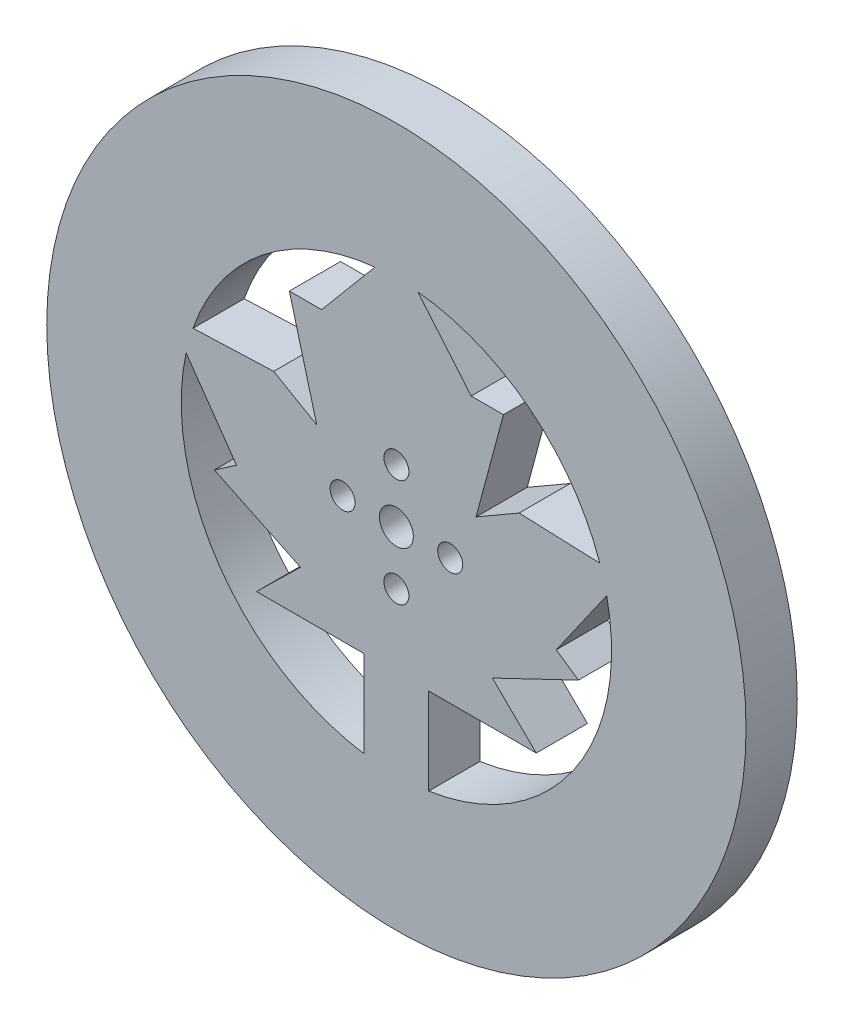
ISO-10303-21;
HEADER;
FILE_DESCRIPTION(('STEP AP214'),'2;1');
FILE_NAME('part.step','',(''),(''),'','','');
FILE_SCHEMA(('AUTOMOTIVE_DESIGN { 1 0 10303 214 1 1 1 1 }'));
ENDSEC;
DATA;
#1=APPLICATION_CONTEXT('core data for automotive mechanical design processes');
#2=APPLICATION_PROTOCOL_DEFINITION('international standard','automotive_design',2000,#1);
#3=PRODUCT_CONTEXT('',#1,'mechanical');
#4=PRODUCT('Part','Part','',(#3));
#5=PRODUCT_RELATED_PRODUCT_CATEGORY('part','',(#4));
#6=PRODUCT_DEFINITION_FORMATION('','',#4);
#7=PRODUCT_DEFINITION_CONTEXT('part definition',#1,'design');
#8=PRODUCT_DEFINITION('design','',#6,#7);
#9=PRODUCT_DEFINITION_SHAPE('','',#8);
#10=(LENGTH_UNIT() NAMED_UNIT(*) SI_UNIT(.MILLI.,.METRE.));
#11=(NAMED_UNIT(*) PLANE_ANGLE_UNIT() SI_UNIT($,.RADIAN.));
#12=(NAMED_UNIT(*) SI_UNIT($,.STERADIAN.) SOLID_ANGLE_UNIT());
#13=UNCERTAINTY_MEASURE_WITH_UNIT(LENGTH_MEASURE(1.E-05),#10,'distance_accuracy_value','');
#14=(GEOMETRIC_REPRESENTATION_CONTEXT(3) GLOBAL_UNCERTAINTY_ASSIGNED_CONTEXT((#13)) GLOBAL_UNIT_ASSIGNED_CONTEXT((#10,
#11,#12)) REPRESENTATION_CONTEXT('',''));
#15=CARTESIAN_POINT('',(0.,0.,0.));
#16=DIRECTION('',(0.,0.,1.));
#17=DIRECTION('',(1.,0.,0.));
#18=AXIS2_PLACEMENT_3D('',#15,#16,#17);
#19=CARTESIAN_POINT('',(0.,0.,6.0452));
#20=DIRECTION('',(0.,0.,1.));
#21=DIRECTION('',(1.,0.,0.));
#22=AXIS2_PLACEMENT_3D('',#19,#20,#21);
#23=PLANE('',#22);
#24=DIRECTION('',(0.866025403784438,-0.500000000000001,0.));
#25=VECTOR('',#24,1.);
#26=CARTESIAN_POINT('',(-9.40429877514202,5.715,6.0452));
#27=LINE('',#26,#25);
#28=CARTESIAN_POINT('',(-14.484298775142,8.64793936748331,6.0452));
#29=VERTEX_POINT('',#28);
#30=CARTESIAN_POINT('',(-9.40429877514202,5.715,6.0452));
#31=VERTEX_POINT('',#30);
#32=EDGE_CURVE('E57',#29,#31,#27,.T.);
#33=ORIENTED_EDGE('',*,*,#32,.F.);
#34=DIRECTION('',(0.999292156618125,0.0376189542850038,0.));
#35=VECTOR('',#34,1.);
#36=CARTESIAN_POINT('',(-14.484298775142,8.64793936748331,6.0452));
#37=LINE('',#36,#35);
#38=CARTESIAN_POINT('',(-24.009298775142,8.28936501343522,6.0452));
#39=VERTEX_POINT('',#38);
#40=EDGE_CURVE('E286',#39,#29,#37,.T.);
#41=ORIENTED_EDGE('',*,*,#40,.F.);
#42=CARTESIAN_POINT('',(0.,0.,6.0452));
#43=DIRECTION('',(0.,0.,1.));
#44=DIRECTION('',(1.,0.,0.));
#45=AXIS2_PLACEMENT_3D('',#42,#43,#44);
#46=CIRCLE('',#45,25.4);
#47=CARTESIAN_POINT('',(-2.54,25.2726809025081,6.0452));
#48=VERTEX_POINT('',#47);
#49=EDGE_CURVE('E292',#48,#39,#46,.T.);
#50=ORIENTED_EDGE('',*,*,#49,.F.);
#51=DIRECTION('',(0.642787609686535,0.766044443118981,0.));
#52=VECTOR('',#51,1.);
#53=CARTESIAN_POINT('',(-8.82710578182357,17.78,6.0452));
#54=LINE('',#53,#52);
#55=CARTESIAN_POINT('',(-8.82710578182357,17.78,6.0452));
#56=VERTEX_POINT('',#55);
#57=EDGE_CURVE('E314',#56,#48,#54,.T.);
#58=ORIENTED_EDGE('',*,*,#57,.F.);
#59=DIRECTION('',(1.,0.,0.));
#60=VECTOR('',#59,1.);
#61=CARTESIAN_POINT('',(-8.82710578182357,17.78,6.0452));
#62=LINE('',#61,#60);
#63=CARTESIAN_POINT('',(-12.6371057818236,17.78,6.0452));
#64=VERTEX_POINT('',#63);
#65=EDGE_CURVE('E310',#64,#56,#62,.T.);
#66=ORIENTED_EDGE('',*,*,#65,.F.);
#67=DIRECTION('',(-0.258819045102525,0.965925826289067,0.));
#68=VECTOR('',#67,1.);
#69=CARTESIAN_POINT('',(-12.6371057818236,17.78,6.0452));
#70=LINE('',#69,#68);
#71=EDGE_CURVE('E307',#31,#64,#70,.T.);
#72=ORIENTED_EDGE('',*,*,#71,.F.);
#73=EDGE_LOOP('',(#33,#41,#50,#58,#66,#72));
#74=FACE_BOUND('',#73,.T.);
#75=DIRECTION('',(0.824862499279753,-0.565333403649527,0.));
#76=VECTOR('',#75,1.);
#77=CARTESIAN_POINT('',(18.8681431333184,-3.1406349865648,6.0452));
#78=LINE('',#77,#76);
#79=CARTESIAN_POINT('',(18.8681431333184,-3.1406349865648,6.0452));
#80=VERTEX_POINT('',#79);
#81=CARTESIAN_POINT('',(21.4870815685317,-4.93556854315204,6.0452));
#82=VERTEX_POINT('',#81);
#83=EDGE_CURVE('E323',#80,#82,#78,.T.);
#84=ORIENTED_EDGE('',*,*,#83,.F.);
#85=DIRECTION('',(-0.573576436351042,-0.819152044288995,0.));
#86=VECTOR('',#85,1.);
#87=CARTESIAN_POINT('',(18.8681431333184,-3.1406349865648,6.0452));
#88=LINE('',#87,#86);
#89=CARTESIAN_POINT('',(24.8262090759448,5.36836501343522,6.0452));
#90=VERTEX_POINT('',#89);
#91=EDGE_CURVE('E340',#90,#80,#88,.T.);
#92=ORIENTED_EDGE('',*,*,#91,.F.);
#93=CARTESIAN_POINT('',(0.,0.,6.0452));
#94=DIRECTION('',(0.,0.,1.));
#95=DIRECTION('',(1.,0.,0.));
#96=AXIS2_PLACEMENT_3D('',#93,#94,#95);
#97=CIRCLE('',#96,25.4);
#98=CARTESIAN_POINT('',(3.81,-25.1126243152722,6.0452));
#99=VERTEX_POINT('',#98);
#100=EDGE_CURVE('E383',#99,#90,#97,.T.);
#101=ORIENTED_EDGE('',*,*,#100,.F.);
#102=DIRECTION('',(0.,-1.,0.));
#103=VECTOR('',#102,1.);
#104=CARTESIAN_POINT('',(3.81,-14.8778779193598,6.0452));
#105=LINE('',#104,#103);
#106=CARTESIAN_POINT('',(3.81,-14.8778779193598,6.0452));
#107=VERTEX_POINT('',#106);
#108=EDGE_CURVE('E379',#107,#99,#105,.T.);
#109=ORIENTED_EDGE('',*,*,#108,.F.);
#110=DIRECTION('',(-1.,0.,0.));
#111=VECTOR('',#110,1.);
#112=CARTESIAN_POINT('',(16.51,-14.8778779193598,6.0452));
#113=LINE('',#112,#111);
#114=CARTESIAN_POINT('',(16.51,-14.8778779193598,6.0452));
#115=VERTEX_POINT('',#114);
#116=EDGE_CURVE('E375',#115,#107,#113,.T.);
#117=ORIENTED_EDGE('',*,*,#116,.F.);
#118=DIRECTION('',(0.714161869141744,-0.699980588776554,0.));
#119=VECTOR('',#118,1.);
#120=CARTESIAN_POINT('',(11.3270815685317,-9.79787791935976,6.0452));
#121=LINE('',#120,#119);
#122=CARTESIAN_POINT('',(11.3270815685317,-9.79787791935976,6.0452));
#123=VERTEX_POINT('',#122);
#124=EDGE_CURVE('E371',#123,#115,#121,.T.);
#125=ORIENTED_EDGE('',*,*,#124,.F.);
#126=DIRECTION('',(-0.902024338808291,-0.431685177180622,0.));
#127=VECTOR('',#126,1.);
#128=CARTESIAN_POINT('',(21.4870815685317,-4.93556854315205,6.0452));
#129=LINE('',#128,#127);
#130=EDGE_CURVE('E367',#82,#123,#129,.T.);
#131=ORIENTED_EDGE('',*,*,#130,.F.);
#132=EDGE_LOOP('',(#84,#92,#101,#109,#117,#125,#131));
#133=FACE_BOUND('',#132,.T.);
#134=DIRECTION('',(0.866025403784438,0.500000000000001,0.));
#135=VECTOR('',#134,1.);
#136=CARTESIAN_POINT('',(9.40429877514202,5.715,6.0452));
#137=LINE('',#136,#135);
#138=CARTESIAN_POINT('',(9.40429877514202,5.715,6.0452));
#139=VERTEX_POINT('',#138);
#140=CARTESIAN_POINT('',(14.484298775142,8.64793936748331,6.0452));
#141=VERTEX_POINT('',#140);
#142=EDGE_CURVE('E393',#139,#141,#137,.T.);
#143=ORIENTED_EDGE('',*,*,#142,.F.);
#144=DIRECTION('',(-0.258819045102525,-0.965925826289067,0.));
#145=VECTOR('',#144,1.);
#146=CARTESIAN_POINT('',(12.6371057818236,17.78,6.0452));
#147=LINE('',#146,#145);
#148=CARTESIAN_POINT('',(12.6371057818236,17.78,6.0452));
#149=VERTEX_POINT('',#148);
#150=EDGE_CURVE('E417',#149,#139,#147,.T.);
#151=ORIENTED_EDGE('',*,*,#150,.F.);
#152=DIRECTION('',(1.,0.,0.));
#153=VECTOR('',#152,1.);
#154=CARTESIAN_POINT('',(8.82710578182357,17.78,6.0452));
#155=LINE('',#154,#153);
#156=CARTESIAN_POINT('',(8.82710578182357,17.78,6.0452));
#157=VERTEX_POINT('',#156);
#158=EDGE_CURVE('E452',#157,#149,#155,.T.);
#159=ORIENTED_EDGE('',*,*,#158,.F.);
#160=DIRECTION('',(0.642787609686535,-0.766044443118981,0.));
#161=VECTOR('',#160,1.);
#162=CARTESIAN_POINT('',(8.82710578182357,17.78,6.0452));
#163=LINE('',#162,#161);
#164=CARTESIAN_POINT('',(2.54,25.2726809025081,6.0452));
#165=VERTEX_POINT('',#164);
#166=EDGE_CURVE('E448',#165,#157,#163,.T.);
#167=ORIENTED_EDGE('',*,*,#166,.F.);
#168=CARTESIAN_POINT('',(0.,0.,6.0452));
#169=DIRECTION('',(0.,0.,1.));
#170=DIRECTION('',(1.,0.,0.));
#171=AXIS2_PLACEMENT_3D('',#168,#169,#170);
#172=CIRCLE('',#171,25.4);
#173=CARTESIAN_POINT('',(24.009298775142,8.28936501343522,6.0452));
#174=VERTEX_POINT('',#173);
#175=EDGE_CURVE('E444',#174,#165,#172,.T.);
#176=ORIENTED_EDGE('',*,*,#175,.F.);
#177=DIRECTION('',(0.999292156618125,-0.037618954285004,0.));
#178=VECTOR('',#177,1.);
#179=CARTESIAN_POINT('',(14.484298775142,8.64793936748331,6.0452));
#180=LINE('',#179,#178);
#181=EDGE_CURVE('E440',#141,#174,#180,.T.);
#182=ORIENTED_EDGE('',*,*,#181,.F.);
#183=EDGE_LOOP('',(#143,#151,#159,#167,#176,#182));
#184=FACE_BOUND('',#183,.T.);
#185=DIRECTION('',(-1.,0.,0.));
#186=VECTOR('',#185,1.);
#187=CARTESIAN_POINT('',(-16.51,-14.8778779193598,6.0452));
#188=LINE('',#187,#186);
#189=CARTESIAN_POINT('',(-3.81,-14.8778779193598,6.0452));
#190=VERTEX_POINT('',#189);
#191=CARTESIAN_POINT('',(-16.51,-14.8778779193598,6.0452));
#192=VERTEX_POINT('',#191);
#193=EDGE_CURVE('E462',#190,#192,#188,.T.);
#194=ORIENTED_EDGE('',*,*,#193,.F.);
#195=DIRECTION('',(0.,1.,0.));
#196=VECTOR('',#195,1.);
#197=CARTESIAN_POINT('',(-3.81,-14.8778779193598,6.0452));
#198=LINE('',#197,#196);
#199=CARTESIAN_POINT('',(-3.81,-25.1126243152722,6.0452));
#200=VERTEX_POINT('',#199);
#201=EDGE_CURVE('E483',#200,#190,#198,.T.);
#202=ORIENTED_EDGE('',*,*,#201,.F.);
#203=CARTESIAN_POINT('',(0.,0.,6.0452));
#204=DIRECTION('',(0.,0.,1.));
#205=DIRECTION('',(1.,0.,0.));
#206=AXIS2_PLACEMENT_3D('',#203,#204,#205);
#207=CIRCLE('',#206,25.4);
#208=CARTESIAN_POINT('',(-24.8262090759448,5.36836501343523,6.0452));
#209=VERTEX_POINT('',#208);
#210=EDGE_CURVE('E526',#209,#200,#207,.T.);
#211=ORIENTED_EDGE('',*,*,#210,.F.);
#212=DIRECTION('',(-0.573576436351042,0.819152044288995,0.));
#213=VECTOR('',#212,1.);
#214=CARTESIAN_POINT('',(-18.8681431333184,-3.1406349865648,6.0452));
#215=LINE('',#214,#213);
#216=CARTESIAN_POINT('',(-18.8681431333184,-3.1406349865648,6.0452));
#217=VERTEX_POINT('',#216);
#218=EDGE_CURVE('E522',#217,#209,#215,.T.);
#219=ORIENTED_EDGE('',*,*,#218,.F.);
#220=DIRECTION('',(0.824862499279753,0.565333403649527,0.));
#221=VECTOR('',#220,1.);
#222=CARTESIAN_POINT('',(-18.8681431333184,-3.1406349865648,6.0452));
#223=LINE('',#222,#221);
#224=CARTESIAN_POINT('',(-21.4870815685317,-4.93556854315205,6.0452));
#225=VERTEX_POINT('',#224);
#226=EDGE_CURVE('E518',#225,#217,#223,.T.);
#227=ORIENTED_EDGE('',*,*,#226,.F.);
#228=DIRECTION('',(-0.902024338808291,0.431685177180622,0.));
#229=VECTOR('',#228,1.);
#230=CARTESIAN_POINT('',(-21.4870815685317,-4.93556854315205,6.0452));
#231=LINE('',#230,#229);
#232=CARTESIAN_POINT('',(-11.3270815685317,-9.79787791935976,6.0452));
#233=VERTEX_POINT('',#232);
#234=EDGE_CURVE('E514',#233,#225,#231,.T.);
#235=ORIENTED_EDGE('',*,*,#234,.F.);
#236=DIRECTION('',(0.714161869141744,0.699980588776554,0.));
#237=VECTOR('',#236,1.);
#238=CARTESIAN_POINT('',(-11.3270815685317,-9.79787791935976,6.0452));
#239=LINE('',#238,#237);
#240=EDGE_CURVE('E510',#192,#233,#239,.T.);
#241=ORIENTED_EDGE('',*,*,#240,.F.);
#242=EDGE_LOOP('',(#194,#202,#211,#219,#227,#235,#241));
#243=FACE_BOUND('',#242,.T.);
#244=CARTESIAN_POINT('',(6.35,0.,6.0452));
#245=DIRECTION('',(0.,0.,1.));
#246=DIRECTION('',(1.,0.,0.));
#247=AXIS2_PLACEMENT_3D('',#244,#245,#246);
#248=CIRCLE('',#247,1.4732);
#249=CARTESIAN_POINT('',(7.8232,0.,6.0452));
#250=VERTEX_POINT('',#249);
#251=EDGE_CURVE('E563',#250,#250,#248,.T.);
#252=ORIENTED_EDGE('',*,*,#251,.F.);
#253=EDGE_LOOP('',(#252));
#254=FACE_BOUND('',#253,.T.);
#255=CARTESIAN_POINT('',(0.,0.,6.0452));
#256=DIRECTION('',(0.,0.,1.));
#257=DIRECTION('',(1.,0.,0.));
#258=AXIS2_PLACEMENT_3D('',#255,#256,#257);
#259=CIRCLE('',#258,2.);
#260=CARTESIAN_POINT('',(2.,0.,6.0452));
#261=VERTEX_POINT('',#260);
#262=EDGE_CURVE('E579',#261,#261,#259,.T.);
#263=ORIENTED_EDGE('',*,*,#262,.F.);
#264=EDGE_LOOP('',(#263));
#265=FACE_BOUND('',#264,.T.);
#266=CARTESIAN_POINT('',(0.,0.,6.0452));
#267=DIRECTION('',(0.,0.,1.));
#268=DIRECTION('',(1.,0.,0.));
#269=AXIS2_PLACEMENT_3D('',#266,#267,#268);
#270=CIRCLE('',#269,41.275);
#271=CARTESIAN_POINT('',(41.275,0.,6.0452));
#272=VERTEX_POINT('',#271);
#273=EDGE_CURVE('E11',#272,#272,#270,.T.);
#274=ORIENTED_EDGE('',*,*,#273,.T.);
#275=EDGE_LOOP('',(#274));
#276=FACE_BOUND('',#275,.T.);
#277=CARTESIAN_POINT('',(-6.35,0.,6.0452));
#278=DIRECTION('',(0.,0.,1.));
#279=DIRECTION('',(1.,0.,0.));
#280=AXIS2_PLACEMENT_3D('',#277,#278,#279);
#281=CIRCLE('',#280,1.4732);
#282=CARTESIAN_POINT('',(-4.8768,0.,6.0452));
#283=VERTEX_POINT('',#282);
#284=EDGE_CURVE('E587',#283,#283,#281,.T.);
#285=ORIENTED_EDGE('',*,*,#284,.F.);
#286=EDGE_LOOP('',(#285));
#287=FACE_BOUND('',#286,.T.);
#288=CARTESIAN_POINT('',(0.,6.35,6.0452));
#289=DIRECTION('',(0.,0.,1.));
#290=DIRECTION('',(1.,0.,0.));
#291=AXIS2_PLACEMENT_3D('',#288,#289,#290);
#292=CIRCLE('',#291,1.4732);
#293=CARTESIAN_POINT('',(1.47320000000002,6.35,6.0452));
#294=VERTEX_POINT('',#293);
#295=EDGE_CURVE('E571',#294,#294,#292,.T.);
#296=ORIENTED_EDGE('',*,*,#295,.F.);
#297=EDGE_LOOP('',(#296));
#298=FACE_BOUND('',#297,.T.);
#299=CARTESIAN_POINT('',(0.,-6.35,6.0452));
#300=DIRECTION('',(0.,0.,1.));
#301=DIRECTION('',(1.,0.,0.));
#302=AXIS2_PLACEMENT_3D('',#299,#300,#301);
#303=CIRCLE('',#302,1.4732);
#304=CARTESIAN_POINT('',(1.47319999999993,-6.35,6.0452));
#305=VERTEX_POINT('',#304);
#306=EDGE_CURVE('E555',#305,#305,#303,.T.);
#307=ORIENTED_EDGE('',*,*,#306,.F.);
#308=EDGE_LOOP('',(#307));
#309=FACE_BOUND('',#308,.T.);
#310=ADVANCED_FACE('F38',(#74,#133,#184,#243,#254,#265,#276,#287,#298,#309),#23,.T.);
#311=CARTESIAN_POINT('',(0.,0.,0.));
#312=DIRECTION('',(0.,0.,1.));
#313=DIRECTION('',(1.,0.,0.));
#314=AXIS2_PLACEMENT_3D('',#311,#312,#313);
#315=PLANE('',#314);
#316=DIRECTION('',(0.999292156618125,0.0376189542850038,0.));
#317=VECTOR('',#316,1.);
#318=CARTESIAN_POINT('',(-14.484298775142,8.64793936748331,0.));
#319=LINE('',#318,#317);
#320=CARTESIAN_POINT('',(-24.009298775142,8.28936501343522,0.));
#321=VERTEX_POINT('',#320);
#322=CARTESIAN_POINT('',(-14.484298775142,8.64793936748331,0.));
#323=VERTEX_POINT('',#322);
#324=EDGE_CURVE('E273',#321,#323,#319,.T.);
#325=ORIENTED_EDGE('',*,*,#324,.T.);
#326=DIRECTION('',(0.866025403784438,-0.500000000000001,0.));
#327=VECTOR('',#326,1.);
#328=CARTESIAN_POINT('',(-9.40429877514202,5.715,0.));
#329=LINE('',#328,#327);
#330=CARTESIAN_POINT('',(-9.40429877514202,5.715,0.));
#331=VERTEX_POINT('',#330);
#332=EDGE_CURVE('E266',#323,#331,#329,.T.);
#333=ORIENTED_EDGE('',*,*,#332,.T.);
#334=DIRECTION('',(-0.258819045102525,0.965925826289067,0.));
#335=VECTOR('',#334,1.);
#336=CARTESIAN_POINT('',(-12.6371057818236,17.78,0.));
#337=LINE('',#336,#335);
#338=CARTESIAN_POINT('',(-12.6371057818236,17.78,0.));
#339=VERTEX_POINT('',#338);
#340=EDGE_CURVE('E276',#331,#339,#337,.T.);
#341=ORIENTED_EDGE('',*,*,#340,.T.);
#342=DIRECTION('',(1.,0.,0.));
#343=VECTOR('',#342,1.);
#344=CARTESIAN_POINT('',(-8.82710578182357,17.78,0.));
#345=LINE('',#344,#343);
#346=CARTESIAN_POINT('',(-8.82710578182357,17.78,0.));
#347=VERTEX_POINT('',#346);
#348=EDGE_CURVE('E68',#339,#347,#345,.T.);
#349=ORIENTED_EDGE('',*,*,#348,.T.);
#350=DIRECTION('',(0.642787609686535,0.766044443118981,0.));
#351=VECTOR('',#350,1.);
#352=CARTESIAN_POINT('',(-8.82710578182357,17.78,0.));
#353=LINE('',#352,#351);
#354=CARTESIAN_POINT('',(-2.54,25.2726809025081,0.));
#355=VERTEX_POINT('',#354);
#356=EDGE_CURVE('E297',#347,#355,#353,.T.);
#357=ORIENTED_EDGE('',*,*,#356,.T.);
#358=CARTESIAN_POINT('',(0.,0.,0.));
#359=DIRECTION('',(0.,0.,1.));
#360=DIRECTION('',(1.,0.,0.));
#361=AXIS2_PLACEMENT_3D('',#358,#359,#360);
#362=CIRCLE('',#361,25.4);
#363=EDGE_CURVE('E301',#355,#321,#362,.T.);
#364=ORIENTED_EDGE('',*,*,#363,.T.);
#365=EDGE_LOOP('',(#325,#333,#341,#349,#357,#364));
#366=FACE_BOUND('',#365,.T.);
#367=DIRECTION('',(-0.573576436351042,-0.819152044288995,0.));
#368=VECTOR('',#367,1.);
#369=CARTESIAN_POINT('',(18.8681431333184,-3.1406349865648,0.));
#370=LINE('',#369,#368);
#371=CARTESIAN_POINT('',(24.8262090759448,5.36836501343522,0.));
#372=VERTEX_POINT('',#371);
#373=CARTESIAN_POINT('',(18.8681431333184,-3.1406349865648,0.));
#374=VERTEX_POINT('',#373);
#375=EDGE_CURVE('E360',#372,#374,#370,.T.);
#376=ORIENTED_EDGE('',*,*,#375,.T.);
#377=DIRECTION('',(0.824862499279753,-0.565333403649527,0.));
#378=VECTOR('',#377,1.);
#379=CARTESIAN_POINT('',(18.8681431333184,-3.1406349865648,0.));
#380=LINE('',#379,#378);
#381=CARTESIAN_POINT('',(21.4870815685317,-4.93556854315205,0.));
#382=VERTEX_POINT('',#381);
#383=EDGE_CURVE('E335',#374,#382,#380,.T.);
#384=ORIENTED_EDGE('',*,*,#383,.T.);
#385=DIRECTION('',(-0.902024338808291,-0.431685177180622,0.));
#386=VECTOR('',#385,1.);
#387=CARTESIAN_POINT('',(21.4870815685317,-4.93556854315205,0.));
#388=LINE('',#387,#386);
#389=CARTESIAN_POINT('',(11.3270815685317,-9.79787791935976,0.));
#390=VERTEX_POINT('',#389);
#391=EDGE_CURVE('E339',#382,#390,#388,.T.);
#392=ORIENTED_EDGE('',*,*,#391,.T.);
#393=DIRECTION('',(0.714161869141744,-0.699980588776554,0.));
#394=VECTOR('',#393,1.);
#395=CARTESIAN_POINT('',(11.3270815685317,-9.79787791935976,0.));
#396=LINE('',#395,#394);
#397=CARTESIAN_POINT('',(16.51,-14.8778779193598,0.));
#398=VERTEX_POINT('',#397);
#399=EDGE_CURVE('E344',#390,#398,#396,.T.);
#400=ORIENTED_EDGE('',*,*,#399,.T.);
#401=DIRECTION('',(-1.,0.,0.));
#402=VECTOR('',#401,1.);
#403=CARTESIAN_POINT('',(16.51,-14.8778779193598,0.));
#404=LINE('',#403,#402);
#405=CARTESIAN_POINT('',(3.81,-14.8778779193598,0.));
#406=VERTEX_POINT('',#405);
#407=EDGE_CURVE('E348',#398,#406,#404,.T.);
#408=ORIENTED_EDGE('',*,*,#407,.T.);
#409=DIRECTION('',(0.,-1.,0.));
#410=VECTOR('',#409,1.);
#411=CARTESIAN_POINT('',(3.81,-14.8778779193598,0.));
#412=LINE('',#411,#410);
#413=CARTESIAN_POINT('',(3.81,-25.1126243152722,0.));
#414=VERTEX_POINT('',#413);
#415=EDGE_CURVE('E352',#406,#414,#412,.T.);
#416=ORIENTED_EDGE('',*,*,#415,.T.);
#417=CARTESIAN_POINT('',(0.,0.,0.));
#418=DIRECTION('',(0.,0.,1.));
#419=DIRECTION('',(1.,0.,0.));
#420=AXIS2_PLACEMENT_3D('',#417,#418,#419);
#421=CIRCLE('',#420,25.4);
#422=EDGE_CURVE('E356',#414,#372,#421,.T.);
#423=ORIENTED_EDGE('',*,*,#422,.T.);
#424=EDGE_LOOP('',(#376,#384,#392,#400,#408,#416,#423));
#425=FACE_BOUND('',#424,.T.);
#426=DIRECTION('',(-0.258819045102525,-0.965925826289067,0.));
#427=VECTOR('',#426,1.);
#428=CARTESIAN_POINT('',(12.6371057818236,17.78,0.));
#429=LINE('',#428,#427);
#430=CARTESIAN_POINT('',(12.6371057818236,17.78,0.));
#431=VERTEX_POINT('',#430);
#432=CARTESIAN_POINT('',(9.40429877514202,5.715,0.));
#433=VERTEX_POINT('',#432);
#434=EDGE_CURVE('E433',#431,#433,#429,.T.);
#435=ORIENTED_EDGE('',*,*,#434,.T.);
#436=DIRECTION('',(0.866025403784438,0.500000000000001,0.));
#437=VECTOR('',#436,1.);
#438=CARTESIAN_POINT('',(9.40429877514202,5.715,0.));
#439=LINE('',#438,#437);
#440=CARTESIAN_POINT('',(14.484298775142,8.64793936748331,0.));
#441=VERTEX_POINT('',#440);
#442=EDGE_CURVE('E412',#433,#441,#439,.T.);
#443=ORIENTED_EDGE('',*,*,#442,.T.);
#444=DIRECTION('',(0.999292156618125,-0.037618954285004,0.));
#445=VECTOR('',#444,1.);
#446=CARTESIAN_POINT('',(14.484298775142,8.64793936748331,0.));
#447=LINE('',#446,#445);
#448=CARTESIAN_POINT('',(24.009298775142,8.28936501343522,0.));
#449=VERTEX_POINT('',#448);
#450=EDGE_CURVE('E416',#441,#449,#447,.T.);
#451=ORIENTED_EDGE('',*,*,#450,.T.);
#452=CARTESIAN_POINT('',(0.,0.,0.));
#453=DIRECTION('',(0.,0.,1.));
#454=DIRECTION('',(1.,0.,0.));
#455=AXIS2_PLACEMENT_3D('',#452,#453,#454);
#456=CIRCLE('',#455,25.4);
#457=CARTESIAN_POINT('',(2.54,25.2726809025081,0.));
#458=VERTEX_POINT('',#457);
#459=EDGE_CURVE('E421',#449,#458,#456,.T.);
#460=ORIENTED_EDGE('',*,*,#459,.T.);
#461=DIRECTION('',(0.642787609686535,-0.766044443118981,0.));
#462=VECTOR('',#461,1.);
#463=CARTESIAN_POINT('',(8.82710578182357,17.78,0.));
#464=LINE('',#463,#462);
#465=CARTESIAN_POINT('',(8.82710578182357,17.78,0.));
#466=VERTEX_POINT('',#465);
#467=EDGE_CURVE('E425',#458,#466,#464,.T.);
#468=ORIENTED_EDGE('',*,*,#467,.T.);
#469=DIRECTION('',(1.,0.,0.));
#470=VECTOR('',#469,1.);
#471=CARTESIAN_POINT('',(8.82710578182357,17.78,0.));
#472=LINE('',#471,#470);
#473=EDGE_CURVE('E429',#466,#431,#472,.T.);
#474=ORIENTED_EDGE('',*,*,#473,.T.);
#475=EDGE_LOOP('',(#435,#443,#451,#460,#468,#474));
#476=FACE_BOUND('',#475,.T.);
#477=DIRECTION('',(0.,1.,0.));
#478=VECTOR('',#477,1.);
#479=CARTESIAN_POINT('',(-3.81,-14.8778779193598,0.));
#480=LINE('',#479,#478);
#481=CARTESIAN_POINT('',(-3.81,-25.1126243152722,0.));
#482=VERTEX_POINT('',#481);
#483=CARTESIAN_POINT('',(-3.81,-14.8778779193598,0.));
#484=VERTEX_POINT('',#483);
#485=EDGE_CURVE('E503',#482,#484,#480,.T.);
#486=ORIENTED_EDGE('',*,*,#485,.T.);
#487=DIRECTION('',(-1.,0.,0.));
#488=VECTOR('',#487,1.);
#489=CARTESIAN_POINT('',(-16.51,-14.8778779193598,0.));
#490=LINE('',#489,#488);
#491=CARTESIAN_POINT('',(-16.51,-14.8778779193598,0.));
#492=VERTEX_POINT('',#491);
#493=EDGE_CURVE('E478',#484,#492,#490,.T.);
#494=ORIENTED_EDGE('',*,*,#493,.T.);
#495=DIRECTION('',(0.714161869141744,0.699980588776554,0.));
#496=VECTOR('',#495,1.);
#497=CARTESIAN_POINT('',(-11.3270815685317,-9.79787791935976,0.));
#498=LINE('',#497,#496);
#499=CARTESIAN_POINT('',(-11.3270815685317,-9.79787791935976,0.));
#500=VERTEX_POINT('',#499);
#501=EDGE_CURVE('E482',#492,#500,#498,.T.);
#502=ORIENTED_EDGE('',*,*,#501,.T.);
#503=DIRECTION('',(-0.902024338808291,0.431685177180622,0.));
#504=VECTOR('',#503,1.);
#505=CARTESIAN_POINT('',(-21.4870815685317,-4.93556854315205,0.));
#506=LINE('',#505,#504);
#507=CARTESIAN_POINT('',(-21.4870815685317,-4.93556854315205,0.));
#508=VERTEX_POINT('',#507);
#509=EDGE_CURVE('E487',#500,#508,#506,.T.);
#510=ORIENTED_EDGE('',*,*,#509,.T.);
#511=DIRECTION('',(0.824862499279753,0.565333403649527,0.));
#512=VECTOR('',#511,1.);
#513=CARTESIAN_POINT('',(-18.8681431333184,-3.1406349865648,0.));
#514=LINE('',#513,#512);
#515=CARTESIAN_POINT('',(-18.8681431333184,-3.1406349865648,0.));
#516=VERTEX_POINT('',#515);
#517=EDGE_CURVE('E491',#508,#516,#514,.T.);
#518=ORIENTED_EDGE('',*,*,#517,.T.);
#519=DIRECTION('',(-0.573576436351042,0.819152044288995,0.));
#520=VECTOR('',#519,1.);
#521=CARTESIAN_POINT('',(-18.8681431333184,-3.1406349865648,0.));
#522=LINE('',#521,#520);
#523=CARTESIAN_POINT('',(-24.8262090759448,5.36836501343523,0.));
#524=VERTEX_POINT('',#523);
#525=EDGE_CURVE('E495',#516,#524,#522,.T.);
#526=ORIENTED_EDGE('',*,*,#525,.T.);
#527=CARTESIAN_POINT('',(0.,0.,0.));
#528=DIRECTION('',(0.,0.,1.));
#529=DIRECTION('',(1.,0.,0.));
#530=AXIS2_PLACEMENT_3D('',#527,#528,#529);
#531=CIRCLE('',#530,25.4);
#532=EDGE_CURVE('E499',#524,#482,#531,.T.);
#533=ORIENTED_EDGE('',*,*,#532,.T.);
#534=EDGE_LOOP('',(#486,#494,#502,#510,#518,#526,#533));
#535=FACE_BOUND('',#534,.T.);
#536=CARTESIAN_POINT('',(6.35,0.,0.));
#537=DIRECTION('',(0.,0.,1.));
#538=DIRECTION('',(1.,0.,0.));
#539=AXIS2_PLACEMENT_3D('',#536,#537,#538);
#540=CIRCLE('',#539,1.4732);
#541=CARTESIAN_POINT('',(7.8232,0.,0.));
#542=VERTEX_POINT('',#541);
#543=EDGE_CURVE('E559',#542,#542,#540,.T.);
#544=ORIENTED_EDGE('',*,*,#543,.T.);
#545=EDGE_LOOP('',(#544));
#546=FACE_BOUND('',#545,.T.);
#547=CARTESIAN_POINT('',(0.,0.,0.));
#548=DIRECTION('',(0.,0.,1.));
#549=DIRECTION('',(1.,0.,0.));
#550=AXIS2_PLACEMENT_3D('',#547,#548,#549);
#551=CIRCLE('',#550,2.);
#552=CARTESIAN_POINT('',(2.,0.,0.));
#553=VERTEX_POINT('',#552);
#554=EDGE_CURVE('E575',#553,#553,#551,.T.);
#555=ORIENTED_EDGE('',*,*,#554,.T.);
#556=EDGE_LOOP('',(#555));
#557=FACE_BOUND('',#556,.T.);
#558=CARTESIAN_POINT('',(0.,0.,0.));
#559=DIRECTION('',(0.,0.,1.));
#560=DIRECTION('',(1.,0.,0.));
#561=AXIS2_PLACEMENT_3D('',#558,#559,#560);
#562=CIRCLE('',#561,41.275);
#563=CARTESIAN_POINT('',(41.275,0.,0.));
#564=VERTEX_POINT('',#563);
#565=EDGE_CURVE('E42',#564,#564,#562,.T.);
#566=ORIENTED_EDGE('',*,*,#565,.F.);
#567=EDGE_LOOP('',(#566));
#568=FACE_BOUND('',#567,.T.);
#569=CARTESIAN_POINT('',(-6.35,0.,0.));
#570=DIRECTION('',(0.,0.,1.));
#571=DIRECTION('',(1.,0.,0.));
#572=AXIS2_PLACEMENT_3D('',#569,#570,#571);
#573=CIRCLE('',#572,1.4732);
#574=CARTESIAN_POINT('',(-4.8768,0.,0.));
#575=VERTEX_POINT('',#574);
#576=EDGE_CURVE('E583',#575,#575,#573,.T.);
#577=ORIENTED_EDGE('',*,*,#576,.T.);
#578=EDGE_LOOP('',(#577));
#579=FACE_BOUND('',#578,.T.);
#580=CARTESIAN_POINT('',(0.,6.35,0.));
#581=DIRECTION('',(0.,0.,1.));
#582=DIRECTION('',(1.,0.,0.));
#583=AXIS2_PLACEMENT_3D('',#580,#581,#582);
#584=CIRCLE('',#583,1.4732);
#585=CARTESIAN_POINT('',(1.47320000000002,6.35,0.));
#586=VERTEX_POINT('',#585);
#587=EDGE_CURVE('E567',#586,#586,#584,.T.);
#588=ORIENTED_EDGE('',*,*,#587,.T.);
#589=EDGE_LOOP('',(#588));
#590=FACE_BOUND('',#589,.T.);
#591=CARTESIAN_POINT('',(0.,-6.35,0.));
#592=DIRECTION('',(0.,0.,1.));
#593=DIRECTION('',(1.,0.,0.));
#594=AXIS2_PLACEMENT_3D('',#591,#592,#593);
#595=CIRCLE('',#594,1.4732);
#596=CARTESIAN_POINT('',(1.47319999999993,-6.35,0.));
#597=VERTEX_POINT('',#596);
#598=EDGE_CURVE('E536',#597,#597,#595,.T.);
#599=ORIENTED_EDGE('',*,*,#598,.T.);
#600=EDGE_LOOP('',(#599));
#601=FACE_BOUND('',#600,.T.);
#602=ADVANCED_FACE('F281',(#366,#425,#476,#535,#546,#557,#568,#579,#590,#601),#315,.F.);
#603=CARTESIAN_POINT('',(0.,0.,6.0452));
#604=DIRECTION('',(0.,0.,-1.));
#605=DIRECTION('',(-1.,0.,0.));
#606=AXIS2_PLACEMENT_3D('',#603,#604,#605);
#607=CYLINDRICAL_SURFACE('',#606,41.275);
#608=ORIENTED_EDGE('',*,*,#273,.F.);
#609=EDGE_LOOP('',(#608));
#610=FACE_BOUND('',#609,.T.);
#611=ORIENTED_EDGE('',*,*,#565,.T.);
#612=EDGE_LOOP('',(#611));
#613=FACE_BOUND('',#612,.T.);
#614=ADVANCED_FACE('F40',(#610,#613),#607,.T.);
#615=CARTESIAN_POINT('',(-6.35,0.,6.0452));
#616=DIRECTION('',(0.,0.,-1.));
#617=DIRECTION('',(-1.,0.,0.));
#618=AXIS2_PLACEMENT_3D('',#615,#616,#617);
#619=CYLINDRICAL_SURFACE('',#618,1.4732);
#620=ORIENTED_EDGE('',*,*,#284,.T.);
#621=EDGE_LOOP('',(#620));
#622=FACE_BOUND('',#621,.T.);
#623=ORIENTED_EDGE('',*,*,#576,.F.);
#624=EDGE_LOOP('',(#623));
#625=FACE_BOUND('',#624,.T.);
#626=ADVANCED_FACE('F597',(#622,#625),#619,.F.);
#627=CARTESIAN_POINT('',(0.,0.,6.0452));
#628=DIRECTION('',(0.,0.,-1.));
#629=DIRECTION('',(-1.,0.,0.));
#630=AXIS2_PLACEMENT_3D('',#627,#628,#629);
#631=CYLINDRICAL_SURFACE('',#630,2.);
#632=ORIENTED_EDGE('',*,*,#262,.T.);
#633=EDGE_LOOP('',(#632));
#634=FACE_BOUND('',#633,.T.);
#635=ORIENTED_EDGE('',*,*,#554,.F.);
#636=EDGE_LOOP('',(#635));
#637=FACE_BOUND('',#636,.T.);
#638=ADVANCED_FACE('F599',(#634,#637),#631,.F.);
#639=CARTESIAN_POINT('',(0.,6.35,6.0452));
#640=DIRECTION('',(0.,0.,-1.));
#641=DIRECTION('',(-1.,0.,0.));
#642=AXIS2_PLACEMENT_3D('',#639,#640,#641);
#643=CYLINDRICAL_SURFACE('',#642,1.4732);
#644=ORIENTED_EDGE('',*,*,#295,.T.);
#645=EDGE_LOOP('',(#644));
#646=FACE_BOUND('',#645,.T.);
#647=ORIENTED_EDGE('',*,*,#587,.F.);
#648=EDGE_LOOP('',(#647));
#649=FACE_BOUND('',#648,.T.);
#650=ADVANCED_FACE('F606',(#646,#649),#643,.F.);
#651=CARTESIAN_POINT('',(6.35,0.,6.0452));
#652=DIRECTION('',(0.,0.,-1.));
#653=DIRECTION('',(-1.,0.,0.));
#654=AXIS2_PLACEMENT_3D('',#651,#652,#653);
#655=CYLINDRICAL_SURFACE('',#654,1.4732);
#656=ORIENTED_EDGE('',*,*,#251,.T.);
#657=EDGE_LOOP('',(#656));
#658=FACE_BOUND('',#657,.T.);
#659=ORIENTED_EDGE('',*,*,#543,.F.);
#660=EDGE_LOOP('',(#659));
#661=FACE_BOUND('',#660,.T.);
#662=ADVANCED_FACE('F646',(#658,#661),#655,.F.);
#663=CARTESIAN_POINT('',(0.,-6.35,6.0452));
#664=DIRECTION('',(0.,0.,-1.));
#665=DIRECTION('',(-1.,0.,0.));
#666=AXIS2_PLACEMENT_3D('',#663,#664,#665);
#667=CYLINDRICAL_SURFACE('',#666,1.4732);
#668=ORIENTED_EDGE('',*,*,#306,.T.);
#669=EDGE_LOOP('',(#668));
#670=FACE_BOUND('',#669,.T.);
#671=ORIENTED_EDGE('',*,*,#598,.F.);
#672=EDGE_LOOP('',(#671));
#673=FACE_BOUND('',#672,.T.);
#674=ADVANCED_FACE('F642',(#670,#673),#667,.F.);
#675=CARTESIAN_POINT('',(-16.51,-14.8778779193598,0.));
#676=DIRECTION('',(0.,1.,0.));
#677=DIRECTION('',(-1.,0.,0.));
#678=AXIS2_PLACEMENT_3D('',#675,#676,#677);
#679=PLANE('',#678);
#680=ORIENTED_EDGE('',*,*,#193,.T.);
#681=DIRECTION('',(0.,0.,1.));
#682=VECTOR('',#681,1.);
#683=CARTESIAN_POINT('',(-16.51,-14.8778779193598,0.));
#684=LINE('',#683,#682);
#685=EDGE_CURVE('E507',#492,#192,#684,.T.);
#686=ORIENTED_EDGE('',*,*,#685,.F.);
#687=ORIENTED_EDGE('',*,*,#493,.F.);
#688=DIRECTION('',(0.,0.,1.));
#689=VECTOR('',#688,1.);
#690=CARTESIAN_POINT('',(-3.81,-14.8778779193598,0.));
#691=LINE('',#690,#689);
#692=EDGE_CURVE('E533',#484,#190,#691,.T.);
#693=ORIENTED_EDGE('',*,*,#692,.T.);
#694=EDGE_LOOP('',(#680,#686,#687,#693));
#695=FACE_BOUND('',#694,.T.);
#696=ADVANCED_FACE('F645',(#695),#679,.F.);
#697=CARTESIAN_POINT('',(-3.81,-14.8778779193598,0.));
#698=DIRECTION('',(1.,0.,0.));
#699=DIRECTION('',(0.,0.,-1.));
#700=AXIS2_PLACEMENT_3D('',#697,#698,#699);
#701=PLANE('',#700);
#702=ORIENTED_EDGE('',*,*,#201,.T.);
#703=ORIENTED_EDGE('',*,*,#692,.F.);
#704=ORIENTED_EDGE('',*,*,#485,.F.);
#705=DIRECTION('',(0.,0.,1.));
#706=VECTOR('',#705,1.);
#707=CARTESIAN_POINT('',(-3.81,-25.1126243152722,0.));
#708=LINE('',#707,#706);
#709=EDGE_CURVE('E537',#482,#200,#708,.T.);
#710=ORIENTED_EDGE('',*,*,#709,.T.);
#711=EDGE_LOOP('',(#702,#703,#704,#710));
#712=FACE_BOUND('',#711,.T.);
#713=ADVANCED_FACE('F654',(#712),#701,.F.);
#714=CARTESIAN_POINT('',(0.,0.,0.));
#715=DIRECTION('',(0.,0.,1.));
#716=DIRECTION('',(1.,0.,0.));
#717=AXIS2_PLACEMENT_3D('',#714,#715,#716);
#718=CYLINDRICAL_SURFACE('',#717,25.4);
#719=ORIENTED_EDGE('',*,*,#210,.T.);
#720=ORIENTED_EDGE('',*,*,#709,.F.);
#721=ORIENTED_EDGE('',*,*,#532,.F.);
#722=DIRECTION('',(0.,0.,1.));
#723=VECTOR('',#722,1.);
#724=CARTESIAN_POINT('',(-24.8262090759448,5.36836501343523,0.));
#725=LINE('',#724,#723);
#726=EDGE_CURVE('E540',#524,#209,#725,.T.);
#727=ORIENTED_EDGE('',*,*,#726,.T.);
#728=EDGE_LOOP('',(#719,#720,#721,#727));
#729=FACE_BOUND('',#728,.T.);
#730=ADVANCED_FACE('F708',(#729),#718,.F.);
#731=CARTESIAN_POINT('',(-18.8681431333184,-3.1406349865648,0.));
#732=DIRECTION('',(0.819152044288995,0.573576436351042,0.));
#733=DIRECTION('',(-0.573576436351042,0.819152044288995,0.));
#734=AXIS2_PLACEMENT_3D('',#731,#732,#733);
#735=PLANE('',#734);
#736=ORIENTED_EDGE('',*,*,#218,.T.);
#737=ORIENTED_EDGE('',*,*,#726,.F.);
#738=ORIENTED_EDGE('',*,*,#525,.F.);
#739=DIRECTION('',(0.,0.,1.));
#740=VECTOR('',#739,1.);
#741=CARTESIAN_POINT('',(-18.8681431333184,-3.1406349865648,0.));
#742=LINE('',#741,#740);
#743=EDGE_CURVE('E543',#516,#217,#742,.T.);
#744=ORIENTED_EDGE('',*,*,#743,.T.);
#745=EDGE_LOOP('',(#736,#737,#738,#744));
#746=FACE_BOUND('',#745,.T.);
#747=ADVANCED_FACE('F719',(#746),#735,.F.);
#748=CARTESIAN_POINT('',(-18.8681431333184,-3.1406349865648,0.));
#749=DIRECTION('',(0.565333403649527,-0.824862499279754,0.));
#750=DIRECTION('',(0.824862499279754,0.565333403649527,0.));
#751=AXIS2_PLACEMENT_3D('',#748,#749,#750);
#752=PLANE('',#751);
#753=ORIENTED_EDGE('',*,*,#226,.T.);
#754=ORIENTED_EDGE('',*,*,#743,.F.);
#755=ORIENTED_EDGE('',*,*,#517,.F.);
#756=DIRECTION('',(0.,0.,1.));
#757=VECTOR('',#756,1.);
#758=CARTESIAN_POINT('',(-21.4870815685317,-4.93556854315205,0.));
#759=LINE('',#758,#757);
#760=EDGE_CURVE('E546',#508,#225,#759,.T.);
#761=ORIENTED_EDGE('',*,*,#760,.T.);
#762=EDGE_LOOP('',(#753,#754,#755,#761));
#763=FACE_BOUND('',#762,.T.);
#764=ADVANCED_FACE('F729',(#763),#752,.F.);
#765=CARTESIAN_POINT('',(-21.4870815685317,-4.93556854315205,0.));
#766=DIRECTION('',(0.431685177180622,0.902024338808291,0.));
#767=DIRECTION('',(-0.902024338808292,0.431685177180622,0.));
#768=AXIS2_PLACEMENT_3D('',#765,#766,#767);
#769=PLANE('',#768);
#770=ORIENTED_EDGE('',*,*,#234,.T.);
#771=ORIENTED_EDGE('',*,*,#760,.F.);
#772=ORIENTED_EDGE('',*,*,#509,.F.);
#773=DIRECTION('',(0.,0.,1.));
#774=VECTOR('',#773,1.);
#775=CARTESIAN_POINT('',(-11.3270815685317,-9.79787791935976,0.));
#776=LINE('',#775,#774);
#777=EDGE_CURVE('E549',#500,#233,#776,.T.);
#778=ORIENTED_EDGE('',*,*,#777,.T.);
#779=EDGE_LOOP('',(#770,#771,#772,#778));
#780=FACE_BOUND('',#779,.T.);
#781=ADVANCED_FACE('F739',(#780),#769,.F.);
#782=CARTESIAN_POINT('',(-11.3270815685317,-9.79787791935976,0.));
#783=DIRECTION('',(0.699980588776554,-0.714161869141744,0.));
#784=DIRECTION('',(0.714161869141744,0.699980588776554,0.));
#785=AXIS2_PLACEMENT_3D('',#782,#783,#784);
#786=PLANE('',#785);
#787=ORIENTED_EDGE('',*,*,#240,.T.);
#788=ORIENTED_EDGE('',*,*,#777,.F.);
#789=ORIENTED_EDGE('',*,*,#501,.F.);
#790=ORIENTED_EDGE('',*,*,#685,.T.);
#791=EDGE_LOOP('',(#787,#788,#789,#790));
#792=FACE_BOUND('',#791,.T.);
#793=ADVANCED_FACE('F749',(#792),#786,.F.);
#794=CARTESIAN_POINT('',(9.40429877514202,5.715,0.));
#795=DIRECTION('',(0.500000000000001,-0.866025403784438,0.));
#796=DIRECTION('',(0.866025403784438,0.500000000000001,0.));
#797=AXIS2_PLACEMENT_3D('',#794,#795,#796);
#798=PLANE('',#797);
#799=ORIENTED_EDGE('',*,*,#142,.T.);
#800=DIRECTION('',(0.,0.,1.));
#801=VECTOR('',#800,1.);
#802=CARTESIAN_POINT('',(14.484298775142,8.64793936748331,0.));
#803=LINE('',#802,#801);
#804=EDGE_CURVE('E437',#441,#141,#803,.T.);
#805=ORIENTED_EDGE('',*,*,#804,.F.);
#806=ORIENTED_EDGE('',*,*,#442,.F.);
#807=DIRECTION('',(0.,0.,1.));
#808=VECTOR('',#807,1.);
#809=CARTESIAN_POINT('',(9.40429877514202,5.715,0.));
#810=LINE('',#809,#808);
#811=EDGE_CURVE('E459',#433,#139,#810,.T.);
#812=ORIENTED_EDGE('',*,*,#811,.T.);
#813=EDGE_LOOP('',(#799,#805,#806,#812));
#814=FACE_BOUND('',#813,.T.);
#815=ADVANCED_FACE('F759',(#814),#798,.F.);
#816=CARTESIAN_POINT('',(12.6371057818236,17.78,0.));
#817=DIRECTION('',(-0.965925826289067,0.258819045102525,0.));
#818=DIRECTION('',(-0.258819045102525,-0.965925826289067,0.));
#819=AXIS2_PLACEMENT_3D('',#816,#817,#818);
#820=PLANE('',#819);
#821=ORIENTED_EDGE('',*,*,#150,.T.);
#822=ORIENTED_EDGE('',*,*,#811,.F.);
#823=ORIENTED_EDGE('',*,*,#434,.F.);
#824=DIRECTION('',(0.,0.,1.));
#825=VECTOR('',#824,1.);
#826=CARTESIAN_POINT('',(12.6371057818236,17.78,0.));
#827=LINE('',#826,#825);
#828=EDGE_CURVE('E463',#431,#149,#827,.T.);
#829=ORIENTED_EDGE('',*,*,#828,.T.);
#830=EDGE_LOOP('',(#821,#822,#823,#829));
#831=FACE_BOUND('',#830,.T.);
#832=ADVANCED_FACE('F768',(#831),#820,.F.);
#833=CARTESIAN_POINT('',(8.82710578182357,17.78,0.));
#834=DIRECTION('',(0.,-1.,0.));
#835=DIRECTION('',(1.,0.,0.));
#836=AXIS2_PLACEMENT_3D('',#833,#834,#835);
#837=PLANE('',#836);
#838=ORIENTED_EDGE('',*,*,#158,.T.);
#839=ORIENTED_EDGE('',*,*,#828,.F.);
#840=ORIENTED_EDGE('',*,*,#473,.F.);
#841=DIRECTION('',(0.,0.,1.));
#842=VECTOR('',#841,1.);
#843=CARTESIAN_POINT('',(8.82710578182357,17.78,0.));
#844=LINE('',#843,#842);
#845=EDGE_CURVE('E466',#466,#157,#844,.T.);
#846=ORIENTED_EDGE('',*,*,#845,.T.);
#847=EDGE_LOOP('',(#838,#839,#840,#846));
#848=FACE_BOUND('',#847,.T.);
#849=ADVANCED_FACE('F778',(#848),#837,.F.);
#850=CARTESIAN_POINT('',(8.82710578182357,17.78,0.));
#851=DIRECTION('',(-0.766044443118981,-0.642787609686535,0.));
#852=DIRECTION('',(0.642787609686535,-0.766044443118981,0.));
#853=AXIS2_PLACEMENT_3D('',#850,#851,#852);
#854=PLANE('',#853);
#855=ORIENTED_EDGE('',*,*,#166,.T.);
#856=ORIENTED_EDGE('',*,*,#845,.F.);
#857=ORIENTED_EDGE('',*,*,#467,.F.);
#858=DIRECTION('',(0.,0.,1.));
#859=VECTOR('',#858,1.);
#860=CARTESIAN_POINT('',(2.54,25.2726809025081,0.));
#861=LINE('',#860,#859);
#862=EDGE_CURVE('E469',#458,#165,#861,.T.);
#863=ORIENTED_EDGE('',*,*,#862,.T.);
#864=EDGE_LOOP('',(#855,#856,#857,#863));
#865=FACE_BOUND('',#864,.T.);
#866=ADVANCED_FACE('F788',(#865),#854,.F.);
#867=CARTESIAN_POINT('',(0.,0.,0.));
#868=DIRECTION('',(0.,0.,1.));
#869=DIRECTION('',(1.,0.,0.));
#870=AXIS2_PLACEMENT_3D('',#867,#868,#869);
#871=CYLINDRICAL_SURFACE('',#870,25.4);
#872=ORIENTED_EDGE('',*,*,#175,.T.);
#873=ORIENTED_EDGE('',*,*,#862,.F.);
#874=ORIENTED_EDGE('',*,*,#459,.F.);
#875=DIRECTION('',(0.,0.,1.));
#876=VECTOR('',#875,1.);
#877=CARTESIAN_POINT('',(24.009298775142,8.28936501343522,0.));
#878=LINE('',#877,#876);
#879=EDGE_CURVE('E472',#449,#174,#878,.T.);
#880=ORIENTED_EDGE('',*,*,#879,.T.);
#881=EDGE_LOOP('',(#872,#873,#874,#880));
#882=FACE_BOUND('',#881,.T.);
#883=ADVANCED_FACE('F797',(#882),#871,.F.);
#884=CARTESIAN_POINT('',(14.484298775142,8.64793936748331,0.));
#885=DIRECTION('',(-0.037618954285004,-0.999292156618125,0.));
#886=DIRECTION('',(0.999292156618125,-0.037618954285004,0.));
#887=AXIS2_PLACEMENT_3D('',#884,#885,#886);
#888=PLANE('',#887);
#889=ORIENTED_EDGE('',*,*,#181,.T.);
#890=ORIENTED_EDGE('',*,*,#879,.F.);
#891=ORIENTED_EDGE('',*,*,#450,.F.);
#892=ORIENTED_EDGE('',*,*,#804,.T.);
#893=EDGE_LOOP('',(#889,#890,#891,#892));
#894=FACE_BOUND('',#893,.T.);
#895=ADVANCED_FACE('F807',(#894),#888,.F.);
#896=CARTESIAN_POINT('',(18.8681431333184,-3.1406349865648,0.));
#897=DIRECTION('',(-0.565333403649527,-0.824862499279754,0.));
#898=DIRECTION('',(0.824862499279754,-0.565333403649527,0.));
#899=AXIS2_PLACEMENT_3D('',#896,#897,#898);
#900=PLANE('',#899);
#901=ORIENTED_EDGE('',*,*,#83,.T.);
#902=DIRECTION('',(0.,0.,1.));
#903=VECTOR('',#902,1.);
#904=CARTESIAN_POINT('',(21.4870815685317,-4.93556854315205,0.));
#905=LINE('',#904,#903);
#906=EDGE_CURVE('E364',#382,#82,#905,.T.);
#907=ORIENTED_EDGE('',*,*,#906,.F.);
#908=ORIENTED_EDGE('',*,*,#383,.F.);
#909=DIRECTION('',(0.,0.,1.));
#910=VECTOR('',#909,1.);
#911=CARTESIAN_POINT('',(18.8681431333184,-3.1406349865648,0.));
#912=LINE('',#911,#910);
#913=EDGE_CURVE('E390',#374,#80,#912,.T.);
#914=ORIENTED_EDGE('',*,*,#913,.T.);
#915=EDGE_LOOP('',(#901,#907,#908,#914));
#916=FACE_BOUND('',#915,.T.);
#917=ADVANCED_FACE('F817',(#916),#900,.F.);
#918=CARTESIAN_POINT('',(18.8681431333184,-3.1406349865648,0.));
#919=DIRECTION('',(-0.819152044288995,0.573576436351042,0.));
#920=DIRECTION('',(-0.573576436351042,-0.819152044288995,0.));
#921=AXIS2_PLACEMENT_3D('',#918,#919,#920);
#922=PLANE('',#921);
#923=ORIENTED_EDGE('',*,*,#91,.T.);
#924=ORIENTED_EDGE('',*,*,#913,.F.);
#925=ORIENTED_EDGE('',*,*,#375,.F.);
#926=DIRECTION('',(0.,0.,1.));
#927=VECTOR('',#926,1.);
#928=CARTESIAN_POINT('',(24.8262090759448,5.36836501343522,0.));
#929=LINE('',#928,#927);
#930=EDGE_CURVE('E394',#372,#90,#929,.T.);
#931=ORIENTED_EDGE('',*,*,#930,.T.);
#932=EDGE_LOOP('',(#923,#924,#925,#931));
#933=FACE_BOUND('',#932,.T.);
#934=ADVANCED_FACE('F829',(#933),#922,.F.);
#935=CARTESIAN_POINT('',(0.,0.,0.));
#936=DIRECTION('',(0.,0.,1.));
#937=DIRECTION('',(1.,0.,0.));
#938=AXIS2_PLACEMENT_3D('',#935,#936,#937);
#939=CYLINDRICAL_SURFACE('',#938,25.4);
#940=ORIENTED_EDGE('',*,*,#100,.T.);
#941=ORIENTED_EDGE('',*,*,#930,.F.);
#942=ORIENTED_EDGE('',*,*,#422,.F.);
#943=DIRECTION('',(0.,0.,1.));
#944=VECTOR('',#943,1.);
#945=CARTESIAN_POINT('',(3.81,-25.1126243152722,0.));
#946=LINE('',#945,#944);
#947=EDGE_CURVE('E397',#414,#99,#946,.T.);
#948=ORIENTED_EDGE('',*,*,#947,.T.);
#949=EDGE_LOOP('',(#940,#941,#942,#948));
#950=FACE_BOUND('',#949,.T.);
#951=ADVANCED_FACE('F839',(#950),#939,.F.);
#952=CARTESIAN_POINT('',(3.81,-14.8778779193598,0.));
#953=DIRECTION('',(-1.,0.,0.));
#954=DIRECTION('',(0.,0.,1.));
#955=AXIS2_PLACEMENT_3D('',#952,#953,#954);
#956=PLANE('',#955);
#957=ORIENTED_EDGE('',*,*,#108,.T.);
#958=ORIENTED_EDGE('',*,*,#947,.F.);
#959=ORIENTED_EDGE('',*,*,#415,.F.);
#960=DIRECTION('',(0.,0.,1.));
#961=VECTOR('',#960,1.);
#962=CARTESIAN_POINT('',(3.81,-14.8778779193598,0.));
#963=LINE('',#962,#961);
#964=EDGE_CURVE('E400',#406,#107,#963,.T.);
#965=ORIENTED_EDGE('',*,*,#964,.T.);
#966=EDGE_LOOP('',(#957,#958,#959,#965));
#967=FACE_BOUND('',#966,.T.);
#968=ADVANCED_FACE('F848',(#967),#956,.F.);
#969=CARTESIAN_POINT('',(16.51,-14.8778779193598,0.));
#970=DIRECTION('',(0.,1.,0.));
#971=DIRECTION('',(-1.,0.,0.));
#972=AXIS2_PLACEMENT_3D('',#969,#970,#971);
#973=PLANE('',#972);
#974=ORIENTED_EDGE('',*,*,#116,.T.);
#975=ORIENTED_EDGE('',*,*,#964,.F.);
#976=ORIENTED_EDGE('',*,*,#407,.F.);
#977=DIRECTION('',(0.,0.,1.));
#978=VECTOR('',#977,1.);
#979=CARTESIAN_POINT('',(16.51,-14.8778779193598,0.));
#980=LINE('',#979,#978);
#981=EDGE_CURVE('E403',#398,#115,#980,.T.);
#982=ORIENTED_EDGE('',*,*,#981,.T.);
#983=EDGE_LOOP('',(#974,#975,#976,#982));
#984=FACE_BOUND('',#983,.T.);
#985=ADVANCED_FACE('F857',(#984),#973,.F.);
#986=CARTESIAN_POINT('',(11.3270815685317,-9.79787791935976,0.));
#987=DIRECTION('',(-0.699980588776554,-0.714161869141744,0.));
#988=DIRECTION('',(0.714161869141744,-0.699980588776554,0.));
#989=AXIS2_PLACEMENT_3D('',#986,#987,#988);
#990=PLANE('',#989);
#991=ORIENTED_EDGE('',*,*,#124,.T.);
#992=ORIENTED_EDGE('',*,*,#981,.F.);
#993=ORIENTED_EDGE('',*,*,#399,.F.);
#994=DIRECTION('',(0.,0.,1.));
#995=VECTOR('',#994,1.);
#996=CARTESIAN_POINT('',(11.3270815685317,-9.79787791935976,0.));
#997=LINE('',#996,#995);
#998=EDGE_CURVE('E406',#390,#123,#997,.T.);
#999=ORIENTED_EDGE('',*,*,#998,.T.);
#1000=EDGE_LOOP('',(#991,#992,#993,#999));
#1001=FACE_BOUND('',#1000,.T.);
#1002=ADVANCED_FACE('F868',(#1001),#990,.F.);
#1003=CARTESIAN_POINT('',(21.4870815685317,-4.93556854315205,0.));
#1004=DIRECTION('',(-0.431685177180622,0.902024338808291,0.));
#1005=DIRECTION('',(-0.902024338808292,-0.431685177180622,0.));
#1006=AXIS2_PLACEMENT_3D('',#1003,#1004,#1005);
#1007=PLANE('',#1006);
#1008=ORIENTED_EDGE('',*,*,#130,.T.);
#1009=ORIENTED_EDGE('',*,*,#998,.F.);
#1010=ORIENTED_EDGE('',*,*,#391,.F.);
#1011=ORIENTED_EDGE('',*,*,#906,.T.);
#1012=EDGE_LOOP('',(#1008,#1009,#1010,#1011));
#1013=FACE_BOUND('',#1012,.T.);
#1014=ADVANCED_FACE('F877',(#1013),#1007,.F.);
#1015=CARTESIAN_POINT('',(-9.40429877514202,5.715,0.));
#1016=DIRECTION('',(-0.500000000000001,-0.866025403784438,0.));
#1017=DIRECTION('',(0.866025403784438,-0.500000000000001,0.));
#1018=AXIS2_PLACEMENT_3D('',#1015,#1016,#1017);
#1019=PLANE('',#1018);
#1020=ORIENTED_EDGE('',*,*,#32,.T.);
#1021=DIRECTION('',(0.,0.,1.));
#1022=VECTOR('',#1021,1.);
#1023=CARTESIAN_POINT('',(-9.40429877514202,5.715,0.));
#1024=LINE('',#1023,#1022);
#1025=EDGE_CURVE('E262',#331,#31,#1024,.T.);
#1026=ORIENTED_EDGE('',*,*,#1025,.F.);
#1027=ORIENTED_EDGE('',*,*,#332,.F.);
#1028=DIRECTION('',(0.,0.,1.));
#1029=VECTOR('',#1028,1.);
#1030=CARTESIAN_POINT('',(-14.484298775142,8.64793936748331,0.));
#1031=LINE('',#1030,#1029);
#1032=EDGE_CURVE('E321',#323,#29,#1031,.T.);
#1033=ORIENTED_EDGE('',*,*,#1032,.T.);
#1034=EDGE_LOOP('',(#1020,#1026,#1027,#1033));
#1035=FACE_BOUND('',#1034,.T.);
#1036=ADVANCED_FACE('F264',(#1035),#1019,.F.);
#1037=CARTESIAN_POINT('',(-14.484298775142,8.64793936748331,0.));
#1038=DIRECTION('',(0.0376189542850038,-0.999292156618125,0.));
#1039=DIRECTION('',(0.999292156618125,0.0376189542850038,0.));
#1040=AXIS2_PLACEMENT_3D('',#1037,#1038,#1039);
#1041=PLANE('',#1040);
#1042=ORIENTED_EDGE('',*,*,#40,.T.);
#1043=ORIENTED_EDGE('',*,*,#1032,.F.);
#1044=ORIENTED_EDGE('',*,*,#324,.F.);
#1045=DIRECTION('',(0.,0.,1.));
#1046=VECTOR('',#1045,1.);
#1047=CARTESIAN_POINT('',(-24.009298775142,8.28936501343522,0.));
#1048=LINE('',#1047,#1046);
#1049=EDGE_CURVE('E324',#321,#39,#1048,.T.);
#1050=ORIENTED_EDGE('',*,*,#1049,.T.);
#1051=EDGE_LOOP('',(#1042,#1043,#1044,#1050));
#1052=FACE_BOUND('',#1051,.T.);
#1053=ADVANCED_FACE('F894',(#1052),#1041,.F.);
#1054=CARTESIAN_POINT('',(0.,0.,0.));
#1055=DIRECTION('',(0.,0.,1.));
#1056=DIRECTION('',(1.,0.,0.));
#1057=AXIS2_PLACEMENT_3D('',#1054,#1055,#1056);
#1058=CYLINDRICAL_SURFACE('',#1057,25.4);
#1059=ORIENTED_EDGE('',*,*,#49,.T.);
#1060=ORIENTED_EDGE('',*,*,#1049,.F.);
#1061=ORIENTED_EDGE('',*,*,#363,.F.);
#1062=DIRECTION('',(0.,0.,1.));
#1063=VECTOR('',#1062,1.);
#1064=CARTESIAN_POINT('',(-2.54,25.2726809025081,0.));
#1065=LINE('',#1064,#1063);
#1066=EDGE_CURVE('E327',#355,#48,#1065,.T.);
#1067=ORIENTED_EDGE('',*,*,#1066,.T.);
#1068=EDGE_LOOP('',(#1059,#1060,#1061,#1067));
#1069=FACE_BOUND('',#1068,.T.);
#1070=ADVANCED_FACE('F903',(#1069),#1058,.F.);
#1071=CARTESIAN_POINT('',(-8.82710578182357,17.78,0.));
#1072=DIRECTION('',(0.766044443118981,-0.642787609686535,0.));
#1073=DIRECTION('',(0.642787609686535,0.766044443118981,0.));
#1074=AXIS2_PLACEMENT_3D('',#1071,#1072,#1073);
#1075=PLANE('',#1074);
#1076=ORIENTED_EDGE('',*,*,#57,.T.);
#1077=ORIENTED_EDGE('',*,*,#1066,.F.);
#1078=ORIENTED_EDGE('',*,*,#356,.F.);
#1079=DIRECTION('',(0.,0.,1.));
#1080=VECTOR('',#1079,1.);
#1081=CARTESIAN_POINT('',(-8.82710578182357,17.78,0.));
#1082=LINE('',#1081,#1080);
#1083=EDGE_CURVE('E330',#347,#56,#1082,.T.);
#1084=ORIENTED_EDGE('',*,*,#1083,.T.);
#1085=EDGE_LOOP('',(#1076,#1077,#1078,#1084));
#1086=FACE_BOUND('',#1085,.T.);
#1087=ADVANCED_FACE('F912',(#1086),#1075,.F.);
#1088=CARTESIAN_POINT('',(-8.82710578182357,17.78,0.));
#1089=DIRECTION('',(0.,-1.,0.));
#1090=DIRECTION('',(1.,0.,0.));
#1091=AXIS2_PLACEMENT_3D('',#1088,#1089,#1090);
#1092=PLANE('',#1091);
#1093=ORIENTED_EDGE('',*,*,#65,.T.);
#1094=ORIENTED_EDGE('',*,*,#1083,.F.);
#1095=ORIENTED_EDGE('',*,*,#348,.F.);
#1096=DIRECTION('',(0.,0.,1.));
#1097=VECTOR('',#1096,1.);
#1098=CARTESIAN_POINT('',(-12.6371057818236,17.78,0.));
#1099=LINE('',#1098,#1097);
#1100=EDGE_CURVE('E272',#339,#64,#1099,.T.);
#1101=ORIENTED_EDGE('',*,*,#1100,.T.);
#1102=EDGE_LOOP('',(#1093,#1094,#1095,#1101));
#1103=FACE_BOUND('',#1102,.T.);
#1104=ADVANCED_FACE('F922',(#1103),#1092,.F.);
#1105=CARTESIAN_POINT('',(-12.6371057818236,17.78,0.));
#1106=DIRECTION('',(0.965925826289067,0.258819045102525,0.));
#1107=DIRECTION('',(-0.258819045102525,0.965925826289067,0.));
#1108=AXIS2_PLACEMENT_3D('',#1105,#1106,#1107);
#1109=PLANE('',#1108);
#1110=ORIENTED_EDGE('',*,*,#71,.T.);
#1111=ORIENTED_EDGE('',*,*,#1100,.F.);
#1112=ORIENTED_EDGE('',*,*,#340,.F.);
#1113=ORIENTED_EDGE('',*,*,#1025,.T.);
#1114=EDGE_LOOP('',(#1110,#1111,#1112,#1113));
#1115=FACE_BOUND('',#1114,.T.);
#1116=ADVANCED_FACE('F277',(#1115),#1109,.F.);
#1117=CLOSED_SHELL('',(#310,#602,#614,#626,#638,#650,#662,#674,#696,#713,#730,#747,#764,#781,
#793,#815,#832,#849,#866,#883,#895,#917,#934,#951,#968,#985,#1002,#1014,#1036,#1053,#1070,#1087,
#1104,#1116));
#1118=MANIFOLD_SOLID_BREP('B2',#1117);
#1119=ADVANCED_BREP_SHAPE_REPRESENTATION('',(#18,#1118),#14);
#1120=SHAPE_DEFINITION_REPRESENTATION(#9,#1119);
ENDSEC;
END-ISO-10303-21;
